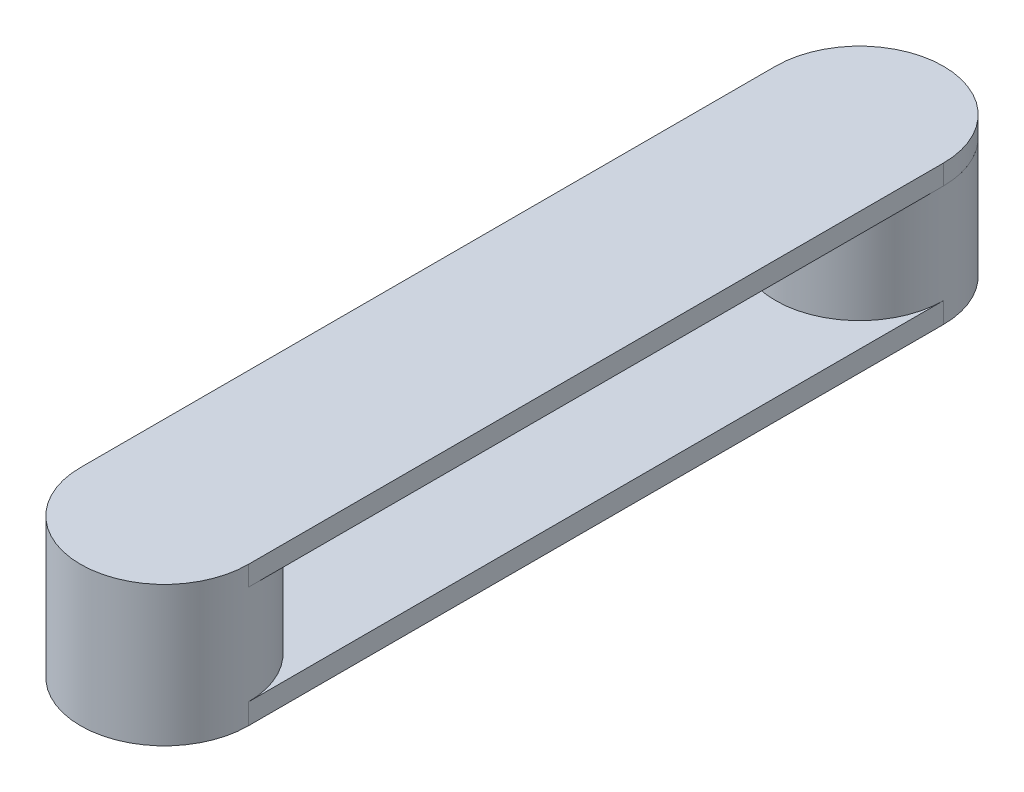
ISO-10303-21;
HEADER;
FILE_DESCRIPTION(('STEP AP214'),'2;1');
FILE_NAME('part.step','',(''),(''),'','','');
FILE_SCHEMA(('AUTOMOTIVE_DESIGN { 1 0 10303 214 1 1 1 1 }'));
ENDSEC;
DATA;
#1=APPLICATION_CONTEXT('core data for automotive mechanical design processes');
#2=APPLICATION_PROTOCOL_DEFINITION('international standard','automotive_design',2000,#1);
#3=PRODUCT_CONTEXT('',#1,'mechanical');
#4=PRODUCT('Part','Part','',(#3));
#5=PRODUCT_RELATED_PRODUCT_CATEGORY('part','',(#4));
#6=PRODUCT_DEFINITION_FORMATION('','',#4);
#7=PRODUCT_DEFINITION_CONTEXT('part definition',#1,'design');
#8=PRODUCT_DEFINITION('design','',#6,#7);
#9=PRODUCT_DEFINITION_SHAPE('','',#8);
#10=(LENGTH_UNIT() NAMED_UNIT(*) SI_UNIT(.MILLI.,.METRE.));
#11=(NAMED_UNIT(*) PLANE_ANGLE_UNIT() SI_UNIT($,.RADIAN.));
#12=(NAMED_UNIT(*) SI_UNIT($,.STERADIAN.) SOLID_ANGLE_UNIT());
#13=UNCERTAINTY_MEASURE_WITH_UNIT(LENGTH_MEASURE(1.E-05),#10,'distance_accuracy_value','');
#14=(GEOMETRIC_REPRESENTATION_CONTEXT(3) GLOBAL_UNCERTAINTY_ASSIGNED_CONTEXT((#13)) GLOBAL_UNIT_ASSIGNED_CONTEXT((#10,
#11,#12)) REPRESENTATION_CONTEXT('',''));
#15=CARTESIAN_POINT('',(0.,0.,0.));
#16=DIRECTION('',(0.,0.,1.));
#17=DIRECTION('',(1.,0.,0.));
#18=AXIS2_PLACEMENT_3D('',#15,#16,#17);
#19=CARTESIAN_POINT('',(-84.5,-1.00000000000001,0.));
#20=DIRECTION('',(1.,0.,0.));
#21=DIRECTION('',(0.,0.,-1.));
#22=AXIS2_PLACEMENT_3D('',#19,#20,#21);
#23=PLANE('',#22);
#24=DIRECTION('',(0.,1.,0.));
#25=VECTOR('',#24,1.);
#26=CARTESIAN_POINT('',(-84.5,-1.00000000000001,-140.34683539677));
#27=LINE('',#26,#25);
#28=CARTESIAN_POINT('',(-84.5,-1.00000000000001,-140.34683539677));
#29=VERTEX_POINT('',#28);
#30=CARTESIAN_POINT('',(-84.5,19.8443971065536,-140.34683539677));
#31=VERTEX_POINT('',#30);
#32=EDGE_CURVE('E186',#29,#31,#27,.T.);
#33=ORIENTED_EDGE('',*,*,#32,.T.);
#34=DIRECTION('',(0.,0.,-1.));
#35=VECTOR('',#34,1.);
#36=CARTESIAN_POINT('',(-84.5,19.8443971065536,0.));
#37=LINE('',#36,#35);
#38=CARTESIAN_POINT('',(-84.5,19.8443971065536,-840.34683539677));
#39=VERTEX_POINT('',#38);
#40=EDGE_CURVE('E160',#31,#39,#37,.T.);
#41=ORIENTED_EDGE('',*,*,#40,.T.);
#42=DIRECTION('',(0.,1.,0.));
#43=VECTOR('',#42,1.);
#44=CARTESIAN_POINT('',(-84.5,-1.00000000000001,-840.34683539677));
#45=LINE('',#44,#43);
#46=CARTESIAN_POINT('',(-84.5,-1.00000000000001,-840.34683539677));
#47=VERTEX_POINT('',#46);
#48=EDGE_CURVE('E187',#47,#39,#45,.T.);
#49=ORIENTED_EDGE('',*,*,#48,.F.);
#50=DIRECTION('',(0.,0.,-1.));
#51=VECTOR('',#50,1.);
#52=CARTESIAN_POINT('',(-84.5,-1.00000000000001,0.));
#53=LINE('',#52,#51);
#54=EDGE_CURVE('E171',#29,#47,#53,.T.);
#55=ORIENTED_EDGE('',*,*,#54,.F.);
#56=EDGE_LOOP('',(#33,#41,#49,#55));
#57=FACE_BOUND('',#56,.T.);
#58=ADVANCED_FACE('F45',(#57),#23,.F.);
#59=CARTESIAN_POINT('',(0.,-1.00000000000001,-840.34683539677));
#60=DIRECTION('',(0.,1.,0.));
#61=DIRECTION('',(0.,0.,1.));
#62=AXIS2_PLACEMENT_3D('',#59,#60,#61);
#63=CYLINDRICAL_SURFACE('',#62,84.5000000000001);
#64=ORIENTED_EDGE('',*,*,#48,.T.);
#65=CARTESIAN_POINT('',(0.,19.8443971065536,-840.34683539677));
#66=DIRECTION('',(0.,1.,0.));
#67=DIRECTION('',(0.,0.,1.));
#68=AXIS2_PLACEMENT_3D('',#65,#66,#67);
#69=CIRCLE('',#68,84.5000000000001);
#70=CARTESIAN_POINT('',(84.5000000000001,19.8443971065536,-840.34683539677));
#71=VERTEX_POINT('',#70);
#72=EDGE_CURVE('E48',#71,#39,#69,.F.);
#73=ORIENTED_EDGE('',*,*,#72,.F.);
#74=DIRECTION('',(0.,1.,0.));
#75=VECTOR('',#74,1.);
#76=CARTESIAN_POINT('',(84.5,-1.00000000000001,-840.34683539677));
#77=LINE('',#76,#75);
#78=CARTESIAN_POINT('',(84.5,-1.00000000000001,-840.34683539677));
#79=VERTEX_POINT('',#78);
#80=EDGE_CURVE('E191',#79,#71,#77,.T.);
#81=ORIENTED_EDGE('',*,*,#80,.F.);
#82=CARTESIAN_POINT('',(0.,-1.00000000000001,-840.34683539677));
#83=DIRECTION('',(0.,1.,0.));
#84=DIRECTION('',(0.,0.,1.));
#85=AXIS2_PLACEMENT_3D('',#82,#83,#84);
#86=CIRCLE('',#85,84.5000000000001);
#87=EDGE_CURVE('E182',#79,#47,#86,.T.);
#88=ORIENTED_EDGE('',*,*,#87,.T.);
#89=EDGE_LOOP('',(#64,#73,#81,#88));
#90=FACE_BOUND('',#89,.T.);
#91=CARTESIAN_POINT('',(0.,119.844397106554,-840.34683539677));
#92=DIRECTION('',(0.,1.,0.));
#93=DIRECTION('',(0.,0.,1.));
#94=AXIS2_PLACEMENT_3D('',#91,#92,#93);
#95=CIRCLE('',#94,84.5000000000001);
#96=CARTESIAN_POINT('',(84.4999980985338,119.844397106554,-840.328909220481));
#97=VERTEX_POINT('',#96);
#98=CARTESIAN_POINT('',(84.4999995246335,119.844397106554,-840.337872308554));
#99=VERTEX_POINT('',#98);
#100=EDGE_CURVE('E149',#97,#99,#95,.T.);
#101=ORIENTED_EDGE('',*,*,#100,.F.);
#102=CARTESIAN_POINT('',(-84.4999980985338,119.844397106554,-840.328909220481));
#103=VERTEX_POINT('',#102);
#104=EDGE_CURVE('E69',#103,#97,#95,.T.);
#105=ORIENTED_EDGE('',*,*,#104,.F.);
#106=CARTESIAN_POINT('',(-84.4999995246335,119.844397106554,-840.337872308423));
#107=VERTEX_POINT('',#106);
#108=EDGE_CURVE('E147',#107,#103,#95,.T.);
#109=ORIENTED_EDGE('',*,*,#108,.F.);
#110=EDGE_CURVE('E157',#99,#107,#95,.T.);
#111=ORIENTED_EDGE('',*,*,#110,.F.);
#112=EDGE_LOOP('',(#101,#105,#109,#111));
#113=FACE_BOUND('',#112,.T.);
#114=ADVANCED_FACE('F215',(#90,#113),#63,.T.);
#115=CARTESIAN_POINT('',(84.5,-1.00000000000001,0.));
#116=DIRECTION('',(1.,0.,0.));
#117=DIRECTION('',(0.,0.,-1.));
#118=AXIS2_PLACEMENT_3D('',#115,#116,#117);
#119=PLANE('',#118);
#120=ORIENTED_EDGE('',*,*,#80,.T.);
#121=DIRECTION('',(0.,0.,-1.));
#122=VECTOR('',#121,1.);
#123=CARTESIAN_POINT('',(84.5,19.8443971065536,0.));
#124=LINE('',#123,#122);
#125=CARTESIAN_POINT('',(84.5,19.8443971065536,-140.34683539677));
#126=VERTEX_POINT('',#125);
#127=EDGE_CURVE('E167',#126,#71,#124,.T.);
#128=ORIENTED_EDGE('',*,*,#127,.F.);
#129=DIRECTION('',(0.,1.,0.));
#130=VECTOR('',#129,1.);
#131=CARTESIAN_POINT('',(84.5,-1.00000000000001,-140.34683539677));
#132=LINE('',#131,#130);
#133=CARTESIAN_POINT('',(84.5,-1.00000000000001,-140.34683539677));
#134=VERTEX_POINT('',#133);
#135=EDGE_CURVE('E195',#134,#126,#132,.T.);
#136=ORIENTED_EDGE('',*,*,#135,.F.);
#137=DIRECTION('',(0.,0.,-1.));
#138=VECTOR('',#137,1.);
#139=CARTESIAN_POINT('',(84.5,-1.00000000000001,0.));
#140=LINE('',#139,#138);
#141=EDGE_CURVE('E178',#134,#79,#140,.T.);
#142=ORIENTED_EDGE('',*,*,#141,.T.);
#143=EDGE_LOOP('',(#120,#128,#136,#142));
#144=FACE_BOUND('',#143,.T.);
#145=ADVANCED_FACE('F210',(#144),#119,.T.);
#146=CARTESIAN_POINT('',(0.,-1.00000000000001,-140.34683539677));
#147=DIRECTION('',(0.,1.,0.));
#148=DIRECTION('',(0.,0.,1.));
#149=AXIS2_PLACEMENT_3D('',#146,#147,#148);
#150=CYLINDRICAL_SURFACE('',#149,84.5);
#151=ORIENTED_EDGE('',*,*,#135,.T.);
#152=CARTESIAN_POINT('',(0.,19.8443971065536,-140.34683539677));
#153=DIRECTION('',(0.,1.,0.));
#154=DIRECTION('',(0.,0.,1.));
#155=AXIS2_PLACEMENT_3D('',#152,#153,#154);
#156=CIRCLE('',#155,84.5);
#157=EDGE_CURVE('E156',#126,#31,#156,.T.);
#158=ORIENTED_EDGE('',*,*,#157,.T.);
#159=ORIENTED_EDGE('',*,*,#32,.F.);
#160=CARTESIAN_POINT('',(0.,-1.00000000000001,-140.34683539677));
#161=DIRECTION('',(0.,1.,0.));
#162=DIRECTION('',(0.,0.,1.));
#163=AXIS2_PLACEMENT_3D('',#160,#161,#162);
#164=CIRCLE('',#163,84.5);
#165=EDGE_CURVE('E174',#29,#134,#164,.T.);
#166=ORIENTED_EDGE('',*,*,#165,.T.);
#167=EDGE_LOOP('',(#151,#158,#159,#166));
#168=FACE_BOUND('',#167,.T.);
#169=CARTESIAN_POINT('',(0.,119.844397106554,-140.34683539677));
#170=DIRECTION('',(0.,1.,0.));
#171=DIRECTION('',(0.,0.,1.));
#172=AXIS2_PLACEMENT_3D('',#169,#170,#171);
#173=CIRCLE('',#172,84.5);
#174=CARTESIAN_POINT('',(84.5,119.844397106554,-140.34683539677));
#175=VERTEX_POINT('',#174);
#176=CARTESIAN_POINT('',(-84.5,119.844397106554,-140.34683539677));
#177=VERTEX_POINT('',#176);
#178=EDGE_CURVE('E61',#175,#177,#173,.T.);
#179=ORIENTED_EDGE('',*,*,#178,.F.);
#180=DIRECTION('',(0.,-1.,0.));
#181=VECTOR('',#180,1.);
#182=CARTESIAN_POINT('',(84.5,139.844397106554,-140.34683539677));
#183=LINE('',#182,#181);
#184=CARTESIAN_POINT('',(84.5,139.844397106554,-140.34683539677));
#185=VERTEX_POINT('',#184);
#186=EDGE_CURVE('E124',#185,#175,#183,.T.);
#187=ORIENTED_EDGE('',*,*,#186,.F.);
#188=CARTESIAN_POINT('',(0.,139.844397106554,-140.34683539677));
#189=DIRECTION('',(0.,1.,0.));
#190=DIRECTION('',(0.,0.,1.));
#191=AXIS2_PLACEMENT_3D('',#188,#189,#190);
#192=CIRCLE('',#191,84.5);
#193=CARTESIAN_POINT('',(-84.5,139.844397106554,-140.34683539677));
#194=VERTEX_POINT('',#193);
#195=EDGE_CURVE('E131',#194,#185,#192,.T.);
#196=ORIENTED_EDGE('',*,*,#195,.F.);
#197=DIRECTION('',(0.,-1.,0.));
#198=VECTOR('',#197,1.);
#199=CARTESIAN_POINT('',(-84.5,139.844397106554,-140.34683539677));
#200=LINE('',#199,#198);
#201=EDGE_CURVE('E232',#194,#177,#200,.T.);
#202=ORIENTED_EDGE('',*,*,#201,.T.);
#203=EDGE_LOOP('',(#179,#187,#196,#202));
#204=FACE_BOUND('',#203,.T.);
#205=ADVANCED_FACE('F142',(#168,#204),#150,.T.);
#206=CARTESIAN_POINT('',(0.,-1.00000000000001,0.));
#207=DIRECTION('',(0.,1.,0.));
#208=DIRECTION('',(0.,0.,1.));
#209=AXIS2_PLACEMENT_3D('',#206,#207,#208);
#210=PLANE('',#209);
#211=ORIENTED_EDGE('',*,*,#54,.T.);
#212=ORIENTED_EDGE('',*,*,#87,.F.);
#213=ORIENTED_EDGE('',*,*,#141,.F.);
#214=ORIENTED_EDGE('',*,*,#165,.F.);
#215=EDGE_LOOP('',(#211,#212,#213,#214));
#216=FACE_BOUND('',#215,.T.);
#217=ADVANCED_FACE('F213',(#216),#210,.F.);
#218=CARTESIAN_POINT('',(0.,19.8443971065536,0.));
#219=DIRECTION('',(0.,1.,0.));
#220=DIRECTION('',(0.,0.,1.));
#221=AXIS2_PLACEMENT_3D('',#218,#219,#220);
#222=PLANE('',#221);
#223=ORIENTED_EDGE('',*,*,#127,.T.);
#224=ORIENTED_EDGE('',*,*,#72,.T.);
#225=ORIENTED_EDGE('',*,*,#40,.F.);
#226=ORIENTED_EDGE('',*,*,#157,.F.);
#227=EDGE_LOOP('',(#223,#224,#225,#226));
#228=FACE_BOUND('',#227,.T.);
#229=ADVANCED_FACE('F207',(#228),#222,.T.);
#230=CARTESIAN_POINT('',(0.,119.844397106554,-840.34683539677));
#231=DIRECTION('',(0.,1.,0.));
#232=DIRECTION('',(0.,0.,1.));
#233=AXIS2_PLACEMENT_3D('',#230,#231,#232);
#234=PLANE('',#233);
#235=CARTESIAN_POINT('',(0.,119.844397106554,-840.328909220077));
#236=DIRECTION('',(0.,1.,0.));
#237=DIRECTION('',(0.,0.,1.));
#238=AXIS2_PLACEMENT_3D('',#235,#236,#237);
#239=CIRCLE('',#238,84.5000000000001);
#240=EDGE_CURVE('E11',#99,#107,#239,.T.);
#241=ORIENTED_EDGE('',*,*,#240,.F.);
#242=ORIENTED_EDGE('',*,*,#110,.T.);
#243=EDGE_LOOP('',(#241,#242));
#244=FACE_BOUND('',#243,.T.);
#245=ADVANCED_FACE('F281',(#244),#234,.T.);
#246=CARTESIAN_POINT('',(0.,119.844397106554,0.));
#247=DIRECTION('',(0.,1.,0.));
#248=DIRECTION('',(0.,0.,1.));
#249=AXIS2_PLACEMENT_3D('',#246,#247,#248);
#250=PLANE('',#249);
#251=DIRECTION('',(0.,0.,-1.));
#252=VECTOR('',#251,1.);
#253=CARTESIAN_POINT('',(84.5,119.844397106554,0.));
#254=LINE('',#253,#252);
#255=EDGE_CURVE('E222',#175,#97,#254,.T.);
#256=ORIENTED_EDGE('',*,*,#255,.F.);
#257=ORIENTED_EDGE('',*,*,#178,.T.);
#258=DIRECTION('',(0.,0.,-1.));
#259=VECTOR('',#258,1.);
#260=CARTESIAN_POINT('',(-84.5,119.844397106554,0.));
#261=LINE('',#260,#259);
#262=EDGE_CURVE('E140',#177,#103,#261,.T.);
#263=ORIENTED_EDGE('',*,*,#262,.T.);
#264=ORIENTED_EDGE('',*,*,#104,.T.);
#265=EDGE_LOOP('',(#256,#257,#263,#264));
#266=FACE_BOUND('',#265,.T.);
#267=ADVANCED_FACE('F221',(#266),#250,.F.);
#268=CARTESIAN_POINT('',(84.5,139.844397106554,0.));
#269=DIRECTION('',(-1.,0.,0.));
#270=DIRECTION('',(0.,0.,1.));
#271=AXIS2_PLACEMENT_3D('',#268,#269,#270);
#272=PLANE('',#271);
#273=ORIENTED_EDGE('',*,*,#255,.T.);
#274=DIRECTION('',(0.,-1.,0.));
#275=VECTOR('',#274,1.);
#276=CARTESIAN_POINT('',(84.5,139.844397106554,-840.328909220077));
#277=LINE('',#276,#275);
#278=CARTESIAN_POINT('',(84.5,139.844397106554,-840.328909220077));
#279=VERTEX_POINT('',#278);
#280=EDGE_CURVE('E126',#279,#97,#277,.T.);
#281=ORIENTED_EDGE('',*,*,#280,.F.);
#282=DIRECTION('',(0.,0.,-1.));
#283=VECTOR('',#282,1.);
#284=CARTESIAN_POINT('',(84.5,139.844397106554,0.));
#285=LINE('',#284,#283);
#286=EDGE_CURVE('E119',#185,#279,#285,.T.);
#287=ORIENTED_EDGE('',*,*,#286,.F.);
#288=ORIENTED_EDGE('',*,*,#186,.T.);
#289=EDGE_LOOP('',(#273,#281,#287,#288));
#290=FACE_BOUND('',#289,.T.);
#291=ADVANCED_FACE('F122',(#290),#272,.F.);
#292=CARTESIAN_POINT('',(0.,139.844397106554,-840.328909220077));
#293=DIRECTION('',(0.,-1.,0.));
#294=DIRECTION('',(0.,0.,-1.));
#295=AXIS2_PLACEMENT_3D('',#292,#293,#294);
#296=CYLINDRICAL_SURFACE('',#295,84.5000000000001);
#297=ORIENTED_EDGE('',*,*,#100,.T.);
#298=ORIENTED_EDGE('',*,*,#240,.T.);
#299=ORIENTED_EDGE('',*,*,#108,.T.);
#300=DIRECTION('',(0.,-1.,0.));
#301=VECTOR('',#300,1.);
#302=CARTESIAN_POINT('',(-84.5,139.844397106554,-840.328909220077));
#303=LINE('',#302,#301);
#304=CARTESIAN_POINT('',(-84.5,139.844397106554,-840.328909220077));
#305=VERTEX_POINT('',#304);
#306=EDGE_CURVE('E150',#305,#103,#303,.T.);
#307=ORIENTED_EDGE('',*,*,#306,.F.);
#308=CARTESIAN_POINT('',(0.,139.844397106554,-840.328909220077));
#309=DIRECTION('',(0.,1.,0.));
#310=DIRECTION('',(0.,0.,1.));
#311=AXIS2_PLACEMENT_3D('',#308,#309,#310);
#312=CIRCLE('',#311,84.5000000000001);
#313=EDGE_CURVE('E130',#279,#305,#312,.T.);
#314=ORIENTED_EDGE('',*,*,#313,.F.);
#315=ORIENTED_EDGE('',*,*,#280,.T.);
#316=EDGE_LOOP('',(#297,#298,#299,#307,#314,#315));
#317=FACE_BOUND('',#316,.T.);
#318=ADVANCED_FACE('F226',(#317),#296,.T.);
#319=CARTESIAN_POINT('',(-84.5,139.844397106554,0.));
#320=DIRECTION('',(-1.,0.,0.));
#321=DIRECTION('',(0.,0.,1.));
#322=AXIS2_PLACEMENT_3D('',#319,#320,#321);
#323=PLANE('',#322);
#324=ORIENTED_EDGE('',*,*,#262,.F.);
#325=ORIENTED_EDGE('',*,*,#201,.F.);
#326=DIRECTION('',(0.,0.,-1.));
#327=VECTOR('',#326,1.);
#328=CARTESIAN_POINT('',(-84.5,139.844397106554,0.));
#329=LINE('',#328,#327);
#330=EDGE_CURVE('E137',#194,#305,#329,.T.);
#331=ORIENTED_EDGE('',*,*,#330,.T.);
#332=ORIENTED_EDGE('',*,*,#306,.T.);
#333=EDGE_LOOP('',(#324,#325,#331,#332));
#334=FACE_BOUND('',#333,.T.);
#335=ADVANCED_FACE('F240',(#334),#323,.T.);
#336=CARTESIAN_POINT('',(0.,139.844397106554,0.));
#337=DIRECTION('',(0.,1.,0.));
#338=DIRECTION('',(0.,0.,1.));
#339=AXIS2_PLACEMENT_3D('',#336,#337,#338);
#340=PLANE('',#339);
#341=ORIENTED_EDGE('',*,*,#195,.T.);
#342=ORIENTED_EDGE('',*,*,#286,.T.);
#343=ORIENTED_EDGE('',*,*,#313,.T.);
#344=ORIENTED_EDGE('',*,*,#330,.F.);
#345=EDGE_LOOP('',(#341,#342,#343,#344));
#346=FACE_BOUND('',#345,.T.);
#347=ADVANCED_FACE('F135',(#346),#340,.T.);
#348=CLOSED_SHELL('',(#58,#114,#145,#205,#217,#229,#245,#267,#291,#318,#335,#347));
#349=MANIFOLD_SOLID_BREP('B2',#348);
#350=ADVANCED_BREP_SHAPE_REPRESENTATION('',(#18,#349),#14);
#351=SHAPE_DEFINITION_REPRESENTATION(#9,#350);
ENDSEC;
END-ISO-10303-21;
